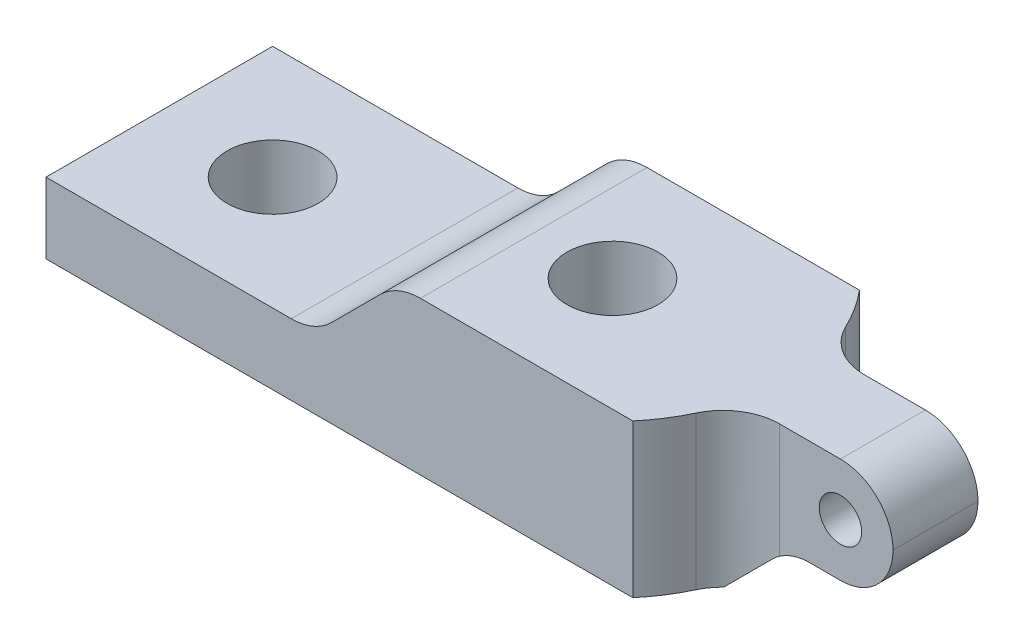
ISO-10303-21;
HEADER;
FILE_DESCRIPTION(('STEP AP214'),'2;1');
FILE_NAME('part.step','',(''),(''),'','','');
FILE_SCHEMA(('AUTOMOTIVE_DESIGN { 1 0 10303 214 1 1 1 1 }'));
ENDSEC;
DATA;
#1=APPLICATION_CONTEXT('core data for automotive mechanical design processes');
#2=APPLICATION_PROTOCOL_DEFINITION('international standard','automotive_design',2000,#1);
#3=PRODUCT_CONTEXT('',#1,'mechanical');
#4=PRODUCT('Part','Part','',(#3));
#5=PRODUCT_RELATED_PRODUCT_CATEGORY('part','',(#4));
#6=PRODUCT_DEFINITION_FORMATION('','',#4);
#7=PRODUCT_DEFINITION_CONTEXT('part definition',#1,'design');
#8=PRODUCT_DEFINITION('design','',#6,#7);
#9=PRODUCT_DEFINITION_SHAPE('','',#8);
#10=(LENGTH_UNIT() NAMED_UNIT(*) SI_UNIT(.MILLI.,.METRE.));
#11=(NAMED_UNIT(*) PLANE_ANGLE_UNIT() SI_UNIT($,.RADIAN.));
#12=(NAMED_UNIT(*) SI_UNIT($,.STERADIAN.) SOLID_ANGLE_UNIT());
#13=UNCERTAINTY_MEASURE_WITH_UNIT(LENGTH_MEASURE(1.E-05),#10,'distance_accuracy_value','');
#14=(GEOMETRIC_REPRESENTATION_CONTEXT(3) GLOBAL_UNCERTAINTY_ASSIGNED_CONTEXT((#13)) GLOBAL_UNIT_ASSIGNED_CONTEXT((#10,
#11,#12)) REPRESENTATION_CONTEXT('',''));
#15=CARTESIAN_POINT('',(0.,0.,0.));
#16=DIRECTION('',(0.,0.,1.));
#17=DIRECTION('',(1.,0.,0.));
#18=AXIS2_PLACEMENT_3D('',#15,#16,#17);
#19=CARTESIAN_POINT('',(0.,0.,12.7));
#20=DIRECTION('',(0.,0.,-1.));
#21=DIRECTION('',(-1.,0.,0.));
#22=AXIS2_PLACEMENT_3D('',#19,#20,#21);
#23=PLANE('',#22);
#24=DIRECTION('',(1.,0.,0.));
#25=VECTOR('',#24,1.);
#26=CARTESIAN_POINT('',(-5.63371999999998,-5.63372,12.7));
#27=LINE('',#26,#25);
#28=CARTESIAN_POINT('',(-40.55872,-5.63372000000001,12.7));
#29=VERTEX_POINT('',#28);
#30=CARTESIAN_POINT('',(-7.67049747643005,-5.63372000000001,12.7));
#31=VERTEX_POINT('',#30);
#32=EDGE_CURVE('E164',#29,#31,#27,.T.);
#33=ORIENTED_EDGE('',*,*,#32,.T.);
#34=DIRECTION('',(0.,1.,0.));
#35=VECTOR('',#34,1.);
#36=CARTESIAN_POINT('',(-7.67049747643005,-5.63372000000001,12.7));
#37=LINE('',#36,#35);
#38=CARTESIAN_POINT('',(-7.67049747643005,2.9464,12.7));
#39=VERTEX_POINT('',#38);
#40=EDGE_CURVE('E168',#31,#39,#37,.T.);
#41=ORIENTED_EDGE('',*,*,#40,.T.);
#42=DIRECTION('',(-1.,0.,0.));
#43=VECTOR('',#42,1.);
#44=CARTESIAN_POINT('',(-40.55872,2.9464,12.7));
#45=LINE('',#44,#43);
#46=CARTESIAN_POINT('',(-19.5712919394654,2.9464,12.7));
#47=VERTEX_POINT('',#46);
#48=EDGE_CURVE('E185',#39,#47,#45,.T.);
#49=ORIENTED_EDGE('',*,*,#48,.T.);
#50=CARTESIAN_POINT('',(-19.5712919394654,-0.2286,12.7));
#51=DIRECTION('',(0.,0.,-1.));
#52=DIRECTION('',(-1.,0.,0.));
#53=AXIS2_PLACEMENT_3D('',#50,#51,#52);
#54=CIRCLE('',#53,3.175);
#55=CARTESIAN_POINT('',(-21.8163559697327,2.0164640302673,12.7));
#56=VERTEX_POINT('',#55);
#57=EDGE_CURVE('E424',#47,#56,#54,.F.);
#58=ORIENTED_EDGE('',*,*,#57,.T.);
#59=DIRECTION('',(0.707106781186551,0.707106781186544,0.));
#60=VECTOR('',#59,1.);
#61=CARTESIAN_POINT('',(-20.88642,2.94640000000001,12.7));
#62=LINE('',#61,#60);
#63=CARTESIAN_POINT('',(-24.5678540302673,-0.735034030267308,12.7));
#64=VERTEX_POINT('',#63);
#65=EDGE_CURVE('E401',#64,#56,#62,.T.);
#66=ORIENTED_EDGE('',*,*,#65,.F.);
#67=CARTESIAN_POINT('',(-26.8129180605346,1.51002999999999,12.7));
#68=DIRECTION('',(0.,0.,-1.));
#69=DIRECTION('',(-1.,0.,0.));
#70=AXIS2_PLACEMENT_3D('',#67,#68,#69);
#71=CIRCLE('',#70,3.175);
#72=CARTESIAN_POINT('',(-26.8129180605346,-1.66497000000001,12.7));
#73=VERTEX_POINT('',#72);
#74=EDGE_CURVE('E372',#64,#73,#71,.T.);
#75=ORIENTED_EDGE('',*,*,#74,.T.);
#76=DIRECTION('',(1.,0.,0.));
#77=VECTOR('',#76,1.);
#78=CARTESIAN_POINT('',(-25.49779,-1.66497000000001,12.7));
#79=LINE('',#78,#77);
#80=CARTESIAN_POINT('',(-40.55872,-1.66497000000001,12.7));
#81=VERTEX_POINT('',#80);
#82=EDGE_CURVE('E176',#81,#73,#79,.T.);
#83=ORIENTED_EDGE('',*,*,#82,.F.);
#84=DIRECTION('',(0.,-1.,0.));
#85=VECTOR('',#84,1.);
#86=CARTESIAN_POINT('',(-40.55872,-5.63372000000001,12.7));
#87=LINE('',#86,#85);
#88=EDGE_CURVE('E180',#81,#29,#87,.T.);
#89=ORIENTED_EDGE('',*,*,#88,.T.);
#90=EDGE_LOOP('',(#33,#41,#49,#58,#66,#75,#83,#89));
#91=FACE_BOUND('',#90,.T.);
#92=ADVANCED_FACE('F35',(#91),#23,.F.);
#93=CARTESIAN_POINT('',(0.,0.,0.));
#94=DIRECTION('',(0.,0.,-1.));
#95=DIRECTION('',(-1.,0.,0.));
#96=AXIS2_PLACEMENT_3D('',#93,#94,#95);
#97=PLANE('',#96);
#98=DIRECTION('',(0.,1.,0.));
#99=VECTOR('',#98,1.);
#100=CARTESIAN_POINT('',(-7.67049747643006,-5.63372000000001,0.));
#101=LINE('',#100,#99);
#102=CARTESIAN_POINT('',(-7.67049747643006,-5.63372000000001,0.));
#103=VERTEX_POINT('',#102);
#104=CARTESIAN_POINT('',(-7.67049747643006,2.9464,0.));
#105=VERTEX_POINT('',#104);
#106=EDGE_CURVE('E363',#103,#105,#101,.T.);
#107=ORIENTED_EDGE('',*,*,#106,.F.);
#108=DIRECTION('',(1.,0.,0.));
#109=VECTOR('',#108,1.);
#110=CARTESIAN_POINT('',(-5.63371999999998,-5.63372,0.));
#111=LINE('',#110,#109);
#112=CARTESIAN_POINT('',(-40.55872,-5.63372000000001,0.));
#113=VERTEX_POINT('',#112);
#114=EDGE_CURVE('E194',#113,#103,#111,.T.);
#115=ORIENTED_EDGE('',*,*,#114,.F.);
#116=DIRECTION('',(0.,-1.,0.));
#117=VECTOR('',#116,1.);
#118=CARTESIAN_POINT('',(-40.55872,-5.63372000000001,0.));
#119=LINE('',#118,#117);
#120=CARTESIAN_POINT('',(-40.55872,-1.66497000000001,0.));
#121=VERTEX_POINT('',#120);
#122=EDGE_CURVE('E191',#121,#113,#119,.T.);
#123=ORIENTED_EDGE('',*,*,#122,.F.);
#124=DIRECTION('',(1.,0.,0.));
#125=VECTOR('',#124,1.);
#126=CARTESIAN_POINT('',(-25.49779,-1.66497000000001,0.));
#127=LINE('',#126,#125);
#128=CARTESIAN_POINT('',(-26.8129180605346,-1.66497000000001,0.));
#129=VERTEX_POINT('',#128);
#130=EDGE_CURVE('E404',#121,#129,#127,.T.);
#131=ORIENTED_EDGE('',*,*,#130,.T.);
#132=CARTESIAN_POINT('',(-26.8129180605346,1.51002999999999,0.));
#133=DIRECTION('',(0.,0.,-1.));
#134=DIRECTION('',(-1.,0.,0.));
#135=AXIS2_PLACEMENT_3D('',#132,#133,#134);
#136=CIRCLE('',#135,3.175);
#137=CARTESIAN_POINT('',(-24.5678540302673,-0.735034030267308,0.));
#138=VERTEX_POINT('',#137);
#139=EDGE_CURVE('E368',#129,#138,#136,.F.);
#140=ORIENTED_EDGE('',*,*,#139,.T.);
#141=DIRECTION('',(0.707106781186551,0.707106781186544,0.));
#142=VECTOR('',#141,1.);
#143=CARTESIAN_POINT('',(-20.88642,2.94640000000001,0.));
#144=LINE('',#143,#142);
#145=CARTESIAN_POINT('',(-21.8163559697327,2.0164640302673,0.));
#146=VERTEX_POINT('',#145);
#147=EDGE_CURVE('E400',#138,#146,#144,.T.);
#148=ORIENTED_EDGE('',*,*,#147,.T.);
#149=CARTESIAN_POINT('',(-19.5712919394654,-0.2286,0.));
#150=DIRECTION('',(0.,0.,-1.));
#151=DIRECTION('',(-1.,0.,0.));
#152=AXIS2_PLACEMENT_3D('',#149,#150,#151);
#153=CIRCLE('',#152,3.175);
#154=CARTESIAN_POINT('',(-19.5712919394654,2.9464,0.));
#155=VERTEX_POINT('',#154);
#156=EDGE_CURVE('E426',#146,#155,#153,.T.);
#157=ORIENTED_EDGE('',*,*,#156,.T.);
#158=DIRECTION('',(-1.,0.,0.));
#159=VECTOR('',#158,1.);
#160=CARTESIAN_POINT('',(-40.55872,2.9464,0.));
#161=LINE('',#160,#159);
#162=EDGE_CURVE('E189',#105,#155,#161,.T.);
#163=ORIENTED_EDGE('',*,*,#162,.F.);
#164=EDGE_LOOP('',(#107,#115,#123,#131,#140,#148,#157,#163));
#165=FACE_BOUND('',#164,.T.);
#166=ADVANCED_FACE('F288',(#165),#97,.T.);
#167=CARTESIAN_POINT('',(-40.55872,2.9464,12.7));
#168=DIRECTION('',(0.,-1.,0.));
#169=DIRECTION('',(0.,0.,-1.));
#170=AXIS2_PLACEMENT_3D('',#167,#168,#169);
#171=PLANE('',#170);
#172=CARTESIAN_POINT('',(-15.15872,2.94640000000001,6.35));
#173=DIRECTION('',(0.,-1.,0.));
#174=DIRECTION('',(0.,0.,-1.));
#175=AXIS2_PLACEMENT_3D('',#172,#173,#174);
#176=CIRCLE('',#175,2.5527);
#177=CARTESIAN_POINT('',(-15.15872,2.94640000000001,3.79730000000001));
#178=VERTEX_POINT('',#177);
#179=EDGE_CURVE('E321',#178,#178,#176,.T.);
#180=ORIENTED_EDGE('',*,*,#179,.T.);
#181=EDGE_LOOP('',(#180));
#182=FACE_BOUND('',#181,.T.);
#183=ORIENTED_EDGE('',*,*,#48,.F.);
#184=CARTESIAN_POINT('',(-15.15872,2.9464,6.35));
#185=DIRECTION('',(0.,-1.,0.));
#186=DIRECTION('',(1.,0.,0.));
#187=AXIS2_PLACEMENT_3D('',#184,#185,#186);
#188=CIRCLE('',#187,9.81814527100205);
#189=CARTESIAN_POINT('',(-6.28356655853812,2.9464,10.5485268789193));
#190=VERTEX_POINT('',#189);
#191=EDGE_CURVE('E169',#190,#39,#188,.T.);
#192=ORIENTED_EDGE('',*,*,#191,.F.);
#193=CARTESIAN_POINT('',(-3.41351204224704,2.9464,11.90625));
#194=DIRECTION('',(0.,-1.,0.));
#195=DIRECTION('',(0.,0.,-1.));
#196=AXIS2_PLACEMENT_3D('',#193,#194,#195);
#197=CIRCLE('',#196,3.175);
#198=CARTESIAN_POINT('',(-3.41351204224704,2.94640000000001,8.73125));
#199=VERTEX_POINT('',#198);
#200=EDGE_CURVE('E12',#190,#199,#197,.T.);
#201=ORIENTED_EDGE('',*,*,#200,.T.);
#202=DIRECTION('',(1.,0.,0.));
#203=VECTOR('',#202,1.);
#204=CARTESIAN_POINT('',(2.9464,2.94640000000001,8.73125));
#205=LINE('',#204,#203);
#206=CARTESIAN_POINT('',(0.,2.94640000000001,8.73125));
#207=VERTEX_POINT('',#206);
#208=EDGE_CURVE('E203',#199,#207,#205,.T.);
#209=ORIENTED_EDGE('',*,*,#208,.T.);
#210=DIRECTION('',(0.,0.,-1.));
#211=VECTOR('',#210,1.);
#212=CARTESIAN_POINT('',(0.,2.9464,12.7));
#213=LINE('',#212,#211);
#214=CARTESIAN_POINT('',(0.,2.94640000000001,3.96875));
#215=VERTEX_POINT('',#214);
#216=EDGE_CURVE('E222',#207,#215,#213,.T.);
#217=ORIENTED_EDGE('',*,*,#216,.T.);
#218=DIRECTION('',(-1.,0.,0.));
#219=VECTOR('',#218,1.);
#220=CARTESIAN_POINT('',(2.9464,2.94640000000001,3.96875));
#221=LINE('',#220,#219);
#222=CARTESIAN_POINT('',(-3.41351204224704,2.94640000000001,3.96875));
#223=VERTEX_POINT('',#222);
#224=EDGE_CURVE('E355',#215,#223,#221,.T.);
#225=ORIENTED_EDGE('',*,*,#224,.T.);
#226=CARTESIAN_POINT('',(-3.41351204224704,2.9464,0.793750000000001));
#227=DIRECTION('',(0.,-1.,0.));
#228=DIRECTION('',(0.,0.,-1.));
#229=AXIS2_PLACEMENT_3D('',#226,#227,#228);
#230=CIRCLE('',#229,3.175);
#231=CARTESIAN_POINT('',(-6.28356655853812,2.9464,2.15147312108071));
#232=VERTEX_POINT('',#231);
#233=EDGE_CURVE('E253',#223,#232,#230,.T.);
#234=ORIENTED_EDGE('',*,*,#233,.T.);
#235=CARTESIAN_POINT('',(-15.15872,2.9464,6.35));
#236=DIRECTION('',(0.,-1.,0.));
#237=DIRECTION('',(-1.,0.,0.));
#238=AXIS2_PLACEMENT_3D('',#235,#236,#237);
#239=CIRCLE('',#238,9.81814527100205);
#240=EDGE_CURVE('E352',#105,#232,#239,.T.);
#241=ORIENTED_EDGE('',*,*,#240,.F.);
#242=ORIENTED_EDGE('',*,*,#162,.T.);
#243=DIRECTION('',(0.,0.,1.));
#244=VECTOR('',#243,1.);
#245=CARTESIAN_POINT('',(-19.5712919394654,2.9464,12.7));
#246=LINE('',#245,#244);
#247=EDGE_CURVE('E325',#155,#47,#246,.T.);
#248=ORIENTED_EDGE('',*,*,#247,.T.);
#249=EDGE_LOOP('',(#183,#192,#201,#209,#217,#225,#234,#241,#242,#248));
#250=FACE_BOUND('',#249,.T.);
#251=ADVANCED_FACE('F293',(#182,#250),#171,.F.);
#252=CARTESIAN_POINT('',(-40.55872,-5.63372000000001,12.7));
#253=DIRECTION('',(1.,0.,0.));
#254=DIRECTION('',(0.,0.,-1.));
#255=AXIS2_PLACEMENT_3D('',#252,#253,#254);
#256=PLANE('',#255);
#257=ORIENTED_EDGE('',*,*,#88,.F.);
#258=DIRECTION('',(0.,0.,1.));
#259=VECTOR('',#258,1.);
#260=CARTESIAN_POINT('',(-40.55872,-1.66497000000001,0.));
#261=LINE('',#260,#259);
#262=EDGE_CURVE('E397',#121,#81,#261,.T.);
#263=ORIENTED_EDGE('',*,*,#262,.F.);
#264=ORIENTED_EDGE('',*,*,#122,.T.);
#265=DIRECTION('',(0.,0.,-1.));
#266=VECTOR('',#265,1.);
#267=CARTESIAN_POINT('',(-40.55872,-5.63372000000001,12.7));
#268=LINE('',#267,#266);
#269=EDGE_CURVE('E183',#29,#113,#268,.T.);
#270=ORIENTED_EDGE('',*,*,#269,.F.);
#271=EDGE_LOOP('',(#257,#263,#264,#270));
#272=FACE_BOUND('',#271,.T.);
#273=ADVANCED_FACE('F310',(#272),#256,.F.);
#274=CARTESIAN_POINT('',(-5.63371999999998,-5.63372,12.7));
#275=DIRECTION('',(0.,1.,0.));
#276=DIRECTION('',(-1.,0.,0.));
#277=AXIS2_PLACEMENT_3D('',#274,#275,#276);
#278=PLANE('',#277);
#279=CARTESIAN_POINT('',(-15.15872,-5.63372,6.35));
#280=DIRECTION('',(0.,-1.,0.));
#281=DIRECTION('',(0.,0.,-1.));
#282=AXIS2_PLACEMENT_3D('',#279,#280,#281);
#283=CIRCLE('',#282,2.55269999999999);
#284=CARTESIAN_POINT('',(-15.15872,-5.63372,3.79730000000002));
#285=VERTEX_POINT('',#284);
#286=EDGE_CURVE('E393',#285,#285,#283,.T.);
#287=ORIENTED_EDGE('',*,*,#286,.F.);
#288=EDGE_LOOP('',(#287));
#289=FACE_BOUND('',#288,.T.);
#290=CARTESIAN_POINT('',(-34.20872,-5.63372000000001,6.35));
#291=DIRECTION('',(0.,-1.,0.));
#292=DIRECTION('',(0.,0.,-1.));
#293=AXIS2_PLACEMENT_3D('',#290,#291,#292);
#294=CIRCLE('',#293,2.55269999999998);
#295=CARTESIAN_POINT('',(-34.20872,-5.63372000000001,3.79730000000002));
#296=VERTEX_POINT('',#295);
#297=EDGE_CURVE('E389',#296,#296,#294,.T.);
#298=ORIENTED_EDGE('',*,*,#297,.F.);
#299=EDGE_LOOP('',(#298));
#300=FACE_BOUND('',#299,.T.);
#301=DIRECTION('',(0.,0.,-1.));
#302=VECTOR('',#301,1.);
#303=CARTESIAN_POINT('',(-5.63371999999998,-5.63372,12.7));
#304=LINE('',#303,#302);
#305=CARTESIAN_POINT('',(-5.63371999999998,-5.63372,9.6366020924314));
#306=VERTEX_POINT('',#305);
#307=CARTESIAN_POINT('',(-5.63371999999998,-5.63372,3.0633979075686));
#308=VERTEX_POINT('',#307);
#309=EDGE_CURVE('E51',#306,#308,#304,.T.);
#310=ORIENTED_EDGE('',*,*,#309,.F.);
#311=CARTESIAN_POINT('',(-3.41351204224704,-5.63372,11.90625));
#312=DIRECTION('',(0.,1.,0.));
#313=DIRECTION('',(-1.,0.,0.));
#314=AXIS2_PLACEMENT_3D('',#311,#312,#313);
#315=CIRCLE('',#314,3.175);
#316=CARTESIAN_POINT('',(-6.28356655853812,-5.63372000000001,10.5485268789193));
#317=VERTEX_POINT('',#316);
#318=EDGE_CURVE('E44',#306,#317,#315,.T.);
#319=ORIENTED_EDGE('',*,*,#318,.T.);
#320=CARTESIAN_POINT('',(-15.15872,-5.63372000000001,6.35));
#321=DIRECTION('',(0.,-1.,0.));
#322=DIRECTION('',(1.,0.,0.));
#323=AXIS2_PLACEMENT_3D('',#320,#321,#322);
#324=CIRCLE('',#323,9.81814527100205);
#325=EDGE_CURVE('E159',#317,#31,#324,.T.);
#326=ORIENTED_EDGE('',*,*,#325,.T.);
#327=ORIENTED_EDGE('',*,*,#32,.F.);
#328=ORIENTED_EDGE('',*,*,#269,.T.);
#329=ORIENTED_EDGE('',*,*,#114,.T.);
#330=CARTESIAN_POINT('',(-15.15872,-5.63372000000001,6.35));
#331=DIRECTION('',(0.,-1.,0.));
#332=DIRECTION('',(-1.,0.,0.));
#333=AXIS2_PLACEMENT_3D('',#330,#331,#332);
#334=CIRCLE('',#333,9.81814527100205);
#335=CARTESIAN_POINT('',(-6.28356655853812,-5.63372000000001,2.15147312108071));
#336=VERTEX_POINT('',#335);
#337=EDGE_CURVE('E364',#103,#336,#334,.T.);
#338=ORIENTED_EDGE('',*,*,#337,.T.);
#339=CARTESIAN_POINT('',(-3.41351204224704,-5.63372,0.793750000000001));
#340=DIRECTION('',(0.,1.,0.));
#341=DIRECTION('',(-1.,0.,0.));
#342=AXIS2_PLACEMENT_3D('',#339,#340,#341);
#343=CIRCLE('',#342,3.175);
#344=EDGE_CURVE('E244',#336,#308,#343,.T.);
#345=ORIENTED_EDGE('',*,*,#344,.T.);
#346=EDGE_LOOP('',(#310,#319,#326,#327,#328,#329,#338,#345));
#347=FACE_BOUND('',#346,.T.);
#348=ADVANCED_FACE('F161',(#289,#300,#347),#278,.F.);
#349=CARTESIAN_POINT('',(-2.94639999999999,-2.9464,12.7));
#350=DIRECTION('',(-0.707106781186549,0.707106781186546,0.));
#351=DIRECTION('',(-0.707106781186546,-0.707106781186549,0.));
#352=AXIS2_PLACEMENT_3D('',#349,#350,#351);
#353=PLANE('',#352);
#354=ORIENTED_EDGE('',*,*,#309,.T.);
#355=CARTESIAN_POINT('',(-3.41351204224704,-3.41351204224705,0.793750000000001));
#356=DIRECTION('',(-0.707106781186549,0.707106781186546,0.));
#357=DIRECTION('',(0.707106781186546,0.707106781186549,0.));
#358=AXIS2_PLACEMENT_3D('',#355,#356,#357);
#359=ELLIPSE('',#358,4.49012806053459,3.175);
#360=CARTESIAN_POINT('',(-3.80938057991195,-3.80938057991196,3.94397429374276));
#361=VERTEX_POINT('',#360);
#362=EDGE_CURVE('E240',#308,#361,#359,.T.);
#363=ORIENTED_EDGE('',*,*,#362,.T.);
#364=DIRECTION('',(0.,0.,-1.));
#365=VECTOR('',#364,1.);
#366=CARTESIAN_POINT('',(-3.80938057991195,-3.80938057991196,8.73125));
#367=LINE('',#366,#365);
#368=CARTESIAN_POINT('',(-3.80938057991195,-3.80938057991196,8.75602570625724));
#369=VERTEX_POINT('',#368);
#370=EDGE_CURVE('E58',#361,#369,#367,.F.);
#371=ORIENTED_EDGE('',*,*,#370,.T.);
#372=CARTESIAN_POINT('',(-3.41351204224704,-3.41351204224705,11.90625));
#373=DIRECTION('',(-0.707106781186549,0.707106781186546,0.));
#374=DIRECTION('',(0.707106781186546,0.707106781186549,0.));
#375=AXIS2_PLACEMENT_3D('',#372,#373,#374);
#376=ELLIPSE('',#375,4.49012806053459,3.175);
#377=EDGE_CURVE('E337',#369,#306,#376,.T.);
#378=ORIENTED_EDGE('',*,*,#377,.T.);
#379=EDGE_LOOP('',(#354,#363,#371,#378));
#380=FACE_BOUND('',#379,.T.);
#381=ADVANCED_FACE('F304',(#380),#353,.F.);
#382=CARTESIAN_POINT('',(2.9464,-2.9464,12.7));
#383=DIRECTION('',(0.,1.,0.));
#384=DIRECTION('',(-1.,0.,0.));
#385=AXIS2_PLACEMENT_3D('',#382,#383,#384);
#386=PLANE('',#385);
#387=DIRECTION('',(-1.,0.,0.));
#388=VECTOR('',#387,1.);
#389=CARTESIAN_POINT('',(2.9464,-2.9464,8.73125));
#390=LINE('',#389,#388);
#391=CARTESIAN_POINT('',(0.,-2.9464,8.73125));
#392=VERTEX_POINT('',#391);
#393=CARTESIAN_POINT('',(-1.7259611598239,-2.9464,8.73125));
#394=VERTEX_POINT('',#393);
#395=EDGE_CURVE('E192',#392,#394,#390,.T.);
#396=ORIENTED_EDGE('',*,*,#395,.T.);
#397=DIRECTION('',(0.,0.,-1.));
#398=VECTOR('',#397,1.);
#399=CARTESIAN_POINT('',(-1.7259611598239,-2.9464,3.96875));
#400=LINE('',#399,#398);
#401=CARTESIAN_POINT('',(-1.7259611598239,-2.9464,3.96875));
#402=VERTEX_POINT('',#401);
#403=EDGE_CURVE('E209',#394,#402,#400,.T.);
#404=ORIENTED_EDGE('',*,*,#403,.T.);
#405=DIRECTION('',(1.,0.,0.));
#406=VECTOR('',#405,1.);
#407=CARTESIAN_POINT('',(2.9464,-2.9464,3.96875));
#408=LINE('',#407,#406);
#409=CARTESIAN_POINT('',(0.,-2.9464,3.96875));
#410=VERTEX_POINT('',#409);
#411=EDGE_CURVE('E202',#402,#410,#408,.T.);
#412=ORIENTED_EDGE('',*,*,#411,.T.);
#413=DIRECTION('',(0.,0.,-1.));
#414=VECTOR('',#413,1.);
#415=CARTESIAN_POINT('',(0.,-2.9464,12.7));
#416=LINE('',#415,#414);
#417=EDGE_CURVE('E198',#410,#392,#416,.F.);
#418=ORIENTED_EDGE('',*,*,#417,.T.);
#419=EDGE_LOOP('',(#396,#404,#412,#418));
#420=FACE_BOUND('',#419,.T.);
#421=ADVANCED_FACE('F300',(#420),#386,.F.);
#422=CARTESIAN_POINT('',(2.9464,2.94640000000001,3.96875));
#423=DIRECTION('',(0.,0.,1.));
#424=DIRECTION('',(1.,0.,0.));
#425=AXIS2_PLACEMENT_3D('',#422,#423,#424);
#426=PLANE('',#425);
#427=CARTESIAN_POINT('',(0.,0.,3.96875));
#428=DIRECTION('',(0.,0.,1.));
#429=DIRECTION('',(1.,0.,0.));
#430=AXIS2_PLACEMENT_3D('',#427,#428,#429);
#431=CIRCLE('',#430,1.190625);
#432=CARTESIAN_POINT('',(1.190625,0.,3.96875));
#433=VERTEX_POINT('',#432);
#434=EDGE_CURVE('E199',#433,#433,#431,.T.);
#435=ORIENTED_EDGE('',*,*,#434,.T.);
#436=EDGE_LOOP('',(#435));
#437=FACE_BOUND('',#436,.T.);
#438=CARTESIAN_POINT('',(-1.7259611598239,-5.8928,3.96875));
#439=DIRECTION('',(0.,0.,1.));
#440=DIRECTION('',(1.,0.,0.));
#441=AXIS2_PLACEMENT_3D('',#438,#439,#440);
#442=CIRCLE('',#441,2.9464);
#443=CARTESIAN_POINT('',(-3.41351204224704,-3.47754742951532,3.96875));
#444=VERTEX_POINT('',#443);
#445=EDGE_CURVE('E224',#402,#444,#442,.T.);
#446=ORIENTED_EDGE('',*,*,#445,.T.);
#447=DIRECTION('',(0.,-1.,0.));
#448=VECTOR('',#447,1.);
#449=CARTESIAN_POINT('',(-3.41351204224704,2.94640000000001,3.96875));
#450=LINE('',#449,#448);
#451=EDGE_CURVE('E367',#444,#223,#450,.F.);
#452=ORIENTED_EDGE('',*,*,#451,.T.);
#453=ORIENTED_EDGE('',*,*,#224,.F.);
#454=CARTESIAN_POINT('',(0.,0.,3.96875));
#455=DIRECTION('',(0.,0.,1.));
#456=DIRECTION('',(1.,0.,0.));
#457=AXIS2_PLACEMENT_3D('',#454,#455,#456);
#458=CIRCLE('',#457,2.9464);
#459=CARTESIAN_POINT('',(2.9464,0.,3.96875));
#460=VERTEX_POINT('',#459);
#461=EDGE_CURVE('E213',#215,#460,#458,.F.);
#462=ORIENTED_EDGE('',*,*,#461,.T.);
#463=CARTESIAN_POINT('',(0.,0.,3.96875));
#464=DIRECTION('',(0.,0.,1.));
#465=DIRECTION('',(1.,0.,0.));
#466=AXIS2_PLACEMENT_3D('',#463,#464,#465);
#467=CIRCLE('',#466,2.9464);
#468=EDGE_CURVE('E215',#460,#410,#467,.F.);
#469=ORIENTED_EDGE('',*,*,#468,.T.);
#470=ORIENTED_EDGE('',*,*,#411,.F.);
#471=EDGE_LOOP('',(#446,#452,#453,#462,#469,#470));
#472=FACE_BOUND('',#471,.T.);
#473=ADVANCED_FACE('F303',(#437,#472),#426,.F.);
#474=CARTESIAN_POINT('',(2.9464,2.94640000000001,8.73125));
#475=DIRECTION('',(0.,0.,-1.));
#476=DIRECTION('',(-1.,0.,0.));
#477=AXIS2_PLACEMENT_3D('',#474,#475,#476);
#478=PLANE('',#477);
#479=CARTESIAN_POINT('',(0.,0.,8.73125));
#480=DIRECTION('',(0.,0.,-1.));
#481=DIRECTION('',(-1.,0.,0.));
#482=AXIS2_PLACEMENT_3D('',#479,#480,#481);
#483=CIRCLE('',#482,1.190625);
#484=CARTESIAN_POINT('',(-1.190625,0.,8.73125));
#485=VERTEX_POINT('',#484);
#486=EDGE_CURVE('E204',#485,#485,#483,.T.);
#487=ORIENTED_EDGE('',*,*,#486,.T.);
#488=EDGE_LOOP('',(#487));
#489=FACE_BOUND('',#488,.T.);
#490=ORIENTED_EDGE('',*,*,#208,.F.);
#491=DIRECTION('',(0.,-1.,0.));
#492=VECTOR('',#491,1.);
#493=CARTESIAN_POINT('',(-3.41351204224704,-5.63372,8.73125));
#494=LINE('',#493,#492);
#495=CARTESIAN_POINT('',(-3.41351204224704,-3.47754742951531,8.73125));
#496=VERTEX_POINT('',#495);
#497=EDGE_CURVE('E370',#199,#496,#494,.T.);
#498=ORIENTED_EDGE('',*,*,#497,.T.);
#499=CARTESIAN_POINT('',(-1.7259611598239,-5.8928,8.73125));
#500=DIRECTION('',(0.,0.,-1.));
#501=DIRECTION('',(-1.,0.,0.));
#502=AXIS2_PLACEMENT_3D('',#499,#500,#501);
#503=CIRCLE('',#502,2.9464);
#504=EDGE_CURVE('E228',#496,#394,#503,.T.);
#505=ORIENTED_EDGE('',*,*,#504,.T.);
#506=ORIENTED_EDGE('',*,*,#395,.F.);
#507=CARTESIAN_POINT('',(0.,0.,8.73125));
#508=DIRECTION('',(0.,0.,-1.));
#509=DIRECTION('',(-1.,0.,0.));
#510=AXIS2_PLACEMENT_3D('',#507,#508,#509);
#511=CIRCLE('',#510,2.9464);
#512=CARTESIAN_POINT('',(2.9464,0.,8.73125));
#513=VERTEX_POINT('',#512);
#514=EDGE_CURVE('E220',#392,#513,#511,.F.);
#515=ORIENTED_EDGE('',*,*,#514,.T.);
#516=CARTESIAN_POINT('',(0.,0.,8.73125));
#517=DIRECTION('',(0.,0.,-1.));
#518=DIRECTION('',(-1.,0.,0.));
#519=AXIS2_PLACEMENT_3D('',#516,#517,#518);
#520=CIRCLE('',#519,2.9464);
#521=EDGE_CURVE('E217',#513,#207,#520,.F.);
#522=ORIENTED_EDGE('',*,*,#521,.T.);
#523=EDGE_LOOP('',(#490,#498,#505,#506,#515,#522));
#524=FACE_BOUND('',#523,.T.);
#525=ADVANCED_FACE('F383',(#489,#524),#478,.F.);
#526=CARTESIAN_POINT('',(0.,0.,12.7));
#527=DIRECTION('',(0.,0.,-1.));
#528=DIRECTION('',(-1.,0.,0.));
#529=AXIS2_PLACEMENT_3D('',#526,#527,#528);
#530=CYLINDRICAL_SURFACE('',#529,1.190625);
#531=ORIENTED_EDGE('',*,*,#486,.F.);
#532=EDGE_LOOP('',(#531));
#533=FACE_BOUND('',#532,.T.);
#534=ORIENTED_EDGE('',*,*,#434,.F.);
#535=EDGE_LOOP('',(#534));
#536=FACE_BOUND('',#535,.T.);
#537=ADVANCED_FACE('F297',(#533,#536),#530,.F.);
#538=CARTESIAN_POINT('',(-1.7259611598239,-5.8928,12.7));
#539=DIRECTION('',(0.,0.,1.));
#540=DIRECTION('',(1.,0.,0.));
#541=AXIS2_PLACEMENT_3D('',#538,#539,#540);
#542=CYLINDRICAL_SURFACE('',#541,2.9464);
#543=ORIENTED_EDGE('',*,*,#504,.F.);
#544=CARTESIAN_POINT('',(-3.41351204224704,-3.47754742951531,8.73125));
#545=CARTESIAN_POINT('',(-3.44894121281623,-3.50230041230882,8.73124934783232));
#546=CARTESIAN_POINT('',(-3.48382160804293,-3.52783317782863,8.73184298727939));
#547=CARTESIAN_POINT('',(-3.55232233783902,-3.58032658262233,8.73410134086659));
#548=CARTESIAN_POINT('',(-3.58594550433002,-3.60728363559887,8.73576347246754));
#549=CARTESIAN_POINT('',(-3.65193961305682,-3.66261292704867,8.74004234115792));
#550=CARTESIAN_POINT('',(-3.68431059468367,-3.69098512094024,8.74265904819141));
#551=CARTESIAN_POINT('',(-3.74781426232083,-3.74914831970876,8.74873716663029));
#552=CARTESIAN_POINT('',(-3.77894377081219,-3.77894258392375,8.75220060168555));
#553=CARTESIAN_POINT('',(-3.80938057991195,-3.80938057991196,8.75602570625724));
#554=B_SPLINE_CURVE_WITH_KNOTS('',3,(#544,#545,#546,#547,#548,#549,#550,#551,#552,#553),
.UNSPECIFIED.,.F.,.F.,(4,2,2,2,4),(0.,0.129639673325148,0.258967180458423,0.388290615911677,
0.517926204272734),.UNSPECIFIED.);
#555=EDGE_CURVE('E339',#496,#369,#554,.T.);
#556=ORIENTED_EDGE('',*,*,#555,.T.);
#557=ORIENTED_EDGE('',*,*,#370,.F.);
#558=CARTESIAN_POINT('',(-3.80938057991195,-3.80938057991196,3.94397429374276));
#559=CARTESIAN_POINT('',(-3.77894377081219,-3.77894258392375,3.94779939831444));
#560=CARTESIAN_POINT('',(-3.74781426232083,-3.74914831970876,3.95126283336971));
#561=CARTESIAN_POINT('',(-3.68431059468367,-3.69098512094024,3.95734095180859));
#562=CARTESIAN_POINT('',(-3.65193961305682,-3.66261292704867,3.95995765884208));
#563=CARTESIAN_POINT('',(-3.58594550433002,-3.60728363559888,3.96423652753246));
#564=CARTESIAN_POINT('',(-3.55232233783902,-3.58032658262234,3.96589865913341));
#565=CARTESIAN_POINT('',(-3.48382160804293,-3.52783317782863,3.96815701272061));
#566=CARTESIAN_POINT('',(-3.44894121281623,-3.50230041230882,3.96875065216767));
#567=CARTESIAN_POINT('',(-3.41351204224704,-3.47754742951532,3.96875));
#568=B_SPLINE_CURVE_WITH_KNOTS('',3,(#558,#559,#560,#561,#562,#563,#564,#565,#566,#567),
.UNSPECIFIED.,.F.,.F.,(4,2,2,2,4),(0.,0.129635588361056,0.25895902381431,0.388286530947583,
0.517926204272731),.UNSPECIFIED.);
#569=EDGE_CURVE('E243',#361,#444,#568,.T.);
#570=ORIENTED_EDGE('',*,*,#569,.T.);
#571=ORIENTED_EDGE('',*,*,#445,.F.);
#572=ORIENTED_EDGE('',*,*,#403,.F.);
#573=EDGE_LOOP('',(#543,#556,#557,#570,#571,#572));
#574=FACE_BOUND('',#573,.T.);
#575=ADVANCED_FACE('F255',(#574),#542,.F.);
#576=CARTESIAN_POINT('',(0.,0.,12.7));
#577=DIRECTION('',(0.,0.,-1.));
#578=DIRECTION('',(-1.,0.,0.));
#579=AXIS2_PLACEMENT_3D('',#576,#577,#578);
#580=CYLINDRICAL_SURFACE('',#579,2.9464);
#581=ORIENTED_EDGE('',*,*,#216,.F.);
#582=ORIENTED_EDGE('',*,*,#521,.F.);
#583=DIRECTION('',(0.,0.,-1.));
#584=VECTOR('',#583,1.);
#585=CARTESIAN_POINT('',(2.9464,0.,12.7));
#586=LINE('',#585,#584);
#587=EDGE_CURVE('E387',#460,#513,#586,.F.);
#588=ORIENTED_EDGE('',*,*,#587,.F.);
#589=ORIENTED_EDGE('',*,*,#461,.F.);
#590=EDGE_LOOP('',(#581,#582,#588,#589));
#591=FACE_BOUND('',#590,.T.);
#592=ADVANCED_FACE('F274',(#591),#580,.T.);
#593=CARTESIAN_POINT('',(0.,0.,12.7));
#594=DIRECTION('',(0.,0.,-1.));
#595=DIRECTION('',(-1.,0.,0.));
#596=AXIS2_PLACEMENT_3D('',#593,#594,#595);
#597=CYLINDRICAL_SURFACE('',#596,2.9464);
#598=ORIENTED_EDGE('',*,*,#514,.F.);
#599=ORIENTED_EDGE('',*,*,#417,.F.);
#600=ORIENTED_EDGE('',*,*,#468,.F.);
#601=ORIENTED_EDGE('',*,*,#587,.T.);
#602=EDGE_LOOP('',(#598,#599,#600,#601));
#603=FACE_BOUND('',#602,.T.);
#604=ADVANCED_FACE('F276',(#603),#597,.T.);
#605=CARTESIAN_POINT('',(-34.20872,-5.63372,6.35));
#606=DIRECTION('',(0.,-1.,0.));
#607=DIRECTION('',(0.,0.,-1.));
#608=AXIS2_PLACEMENT_3D('',#605,#606,#607);
#609=CYLINDRICAL_SURFACE('',#608,2.55269999999999);
#610=CARTESIAN_POINT('',(-34.20872,-1.66497000000001,6.35));
#611=DIRECTION('',(0.,-1.,0.));
#612=DIRECTION('',(1.,0.,0.));
#613=AXIS2_PLACEMENT_3D('',#610,#611,#612);
#614=CIRCLE('',#613,2.55269999999999);
#615=CARTESIAN_POINT('',(-31.65602,-1.66497000000001,6.35));
#616=VERTEX_POINT('',#615);
#617=EDGE_CURVE('E396',#616,#616,#614,.F.);
#618=ORIENTED_EDGE('',*,*,#617,.T.);
#619=EDGE_LOOP('',(#618));
#620=FACE_BOUND('',#619,.T.);
#621=ORIENTED_EDGE('',*,*,#297,.T.);
#622=EDGE_LOOP('',(#621));
#623=FACE_BOUND('',#622,.T.);
#624=ADVANCED_FACE('F279',(#620,#623),#609,.F.);
#625=CARTESIAN_POINT('',(-15.15872,-5.63372,6.35));
#626=DIRECTION('',(0.,-1.,0.));
#627=DIRECTION('',(0.,0.,-1.));
#628=AXIS2_PLACEMENT_3D('',#625,#626,#627);
#629=CYLINDRICAL_SURFACE('',#628,2.55269999999999);
#630=ORIENTED_EDGE('',*,*,#179,.F.);
#631=EDGE_LOOP('',(#630));
#632=FACE_BOUND('',#631,.T.);
#633=ORIENTED_EDGE('',*,*,#286,.T.);
#634=EDGE_LOOP('',(#633));
#635=FACE_BOUND('',#634,.T.);
#636=ADVANCED_FACE('F284',(#632,#635),#629,.F.);
#637=CARTESIAN_POINT('',(-25.49779,-1.66497000000001,0.));
#638=DIRECTION('',(0.,-1.,0.));
#639=DIRECTION('',(1.,0.,0.));
#640=AXIS2_PLACEMENT_3D('',#637,#638,#639);
#641=PLANE('',#640);
#642=ORIENTED_EDGE('',*,*,#82,.T.);
#643=DIRECTION('',(0.,0.,1.));
#644=VECTOR('',#643,1.);
#645=CARTESIAN_POINT('',(-26.8129180605346,-1.66497000000001,0.));
#646=LINE('',#645,#644);
#647=EDGE_CURVE('E428',#73,#129,#646,.F.);
#648=ORIENTED_EDGE('',*,*,#647,.T.);
#649=ORIENTED_EDGE('',*,*,#130,.F.);
#650=ORIENTED_EDGE('',*,*,#262,.T.);
#651=EDGE_LOOP('',(#642,#648,#649,#650));
#652=FACE_BOUND('',#651,.T.);
#653=ORIENTED_EDGE('',*,*,#617,.F.);
#654=EDGE_LOOP('',(#653));
#655=FACE_BOUND('',#654,.T.);
#656=ADVANCED_FACE('F436',(#652,#655),#641,.F.);
#657=CARTESIAN_POINT('',(-20.88642,2.94640000000001,0.));
#658=DIRECTION('',(0.707106781186544,-0.707106781186551,0.));
#659=DIRECTION('',(0.707106781186551,0.707106781186544,0.));
#660=AXIS2_PLACEMENT_3D('',#657,#658,#659);
#661=PLANE('',#660);
#662=ORIENTED_EDGE('',*,*,#147,.F.);
#663=DIRECTION('',(0.,0.,1.));
#664=VECTOR('',#663,1.);
#665=CARTESIAN_POINT('',(-24.5678540302673,-0.735034030267307,12.7));
#666=LINE('',#665,#664);
#667=EDGE_CURVE('E422',#138,#64,#666,.T.);
#668=ORIENTED_EDGE('',*,*,#667,.T.);
#669=ORIENTED_EDGE('',*,*,#65,.T.);
#670=DIRECTION('',(0.,0.,1.));
#671=VECTOR('',#670,1.);
#672=CARTESIAN_POINT('',(-21.8163559697327,2.0164640302673,0.));
#673=LINE('',#672,#671);
#674=EDGE_CURVE('E420',#56,#146,#673,.F.);
#675=ORIENTED_EDGE('',*,*,#674,.T.);
#676=EDGE_LOOP('',(#662,#668,#669,#675));
#677=FACE_BOUND('',#676,.T.);
#678=ADVANCED_FACE('F272',(#677),#661,.F.);
#679=CARTESIAN_POINT('',(-26.8129180605346,1.51002999999999,0.));
#680=DIRECTION('',(0.,0.,-1.));
#681=DIRECTION('',(-1.,0.,0.));
#682=AXIS2_PLACEMENT_3D('',#679,#680,#681);
#683=CYLINDRICAL_SURFACE('',#682,3.175);
#684=ORIENTED_EDGE('',*,*,#139,.F.);
#685=ORIENTED_EDGE('',*,*,#647,.F.);
#686=ORIENTED_EDGE('',*,*,#74,.F.);
#687=ORIENTED_EDGE('',*,*,#667,.F.);
#688=EDGE_LOOP('',(#684,#685,#686,#687));
#689=FACE_BOUND('',#688,.T.);
#690=ADVANCED_FACE('F268',(#689),#683,.F.);
#691=CARTESIAN_POINT('',(-19.5712919394654,-0.2286,12.7));
#692=DIRECTION('',(0.,0.,1.));
#693=DIRECTION('',(1.,0.,0.));
#694=AXIS2_PLACEMENT_3D('',#691,#692,#693);
#695=CYLINDRICAL_SURFACE('',#694,3.175);
#696=ORIENTED_EDGE('',*,*,#156,.F.);
#697=ORIENTED_EDGE('',*,*,#674,.F.);
#698=ORIENTED_EDGE('',*,*,#57,.F.);
#699=ORIENTED_EDGE('',*,*,#247,.F.);
#700=EDGE_LOOP('',(#696,#697,#698,#699));
#701=FACE_BOUND('',#700,.T.);
#702=ADVANCED_FACE('F265',(#701),#695,.T.);
#703=CARTESIAN_POINT('',(-15.15872,-5.63372000000001,6.35));
#704=DIRECTION('',(0.,1.,0.));
#705=DIRECTION('',(-1.,0.,0.));
#706=AXIS2_PLACEMENT_3D('',#703,#704,#705);
#707=CYLINDRICAL_SURFACE('',#706,9.81814527100205);
#708=ORIENTED_EDGE('',*,*,#325,.F.);
#709=DIRECTION('',(0.,1.,0.));
#710=VECTOR('',#709,1.);
#711=CARTESIAN_POINT('',(-6.28356655853812,-5.63372000000001,10.5485268789193));
#712=LINE('',#711,#710);
#713=EDGE_CURVE('E377',#317,#190,#712,.T.);
#714=ORIENTED_EDGE('',*,*,#713,.T.);
#715=ORIENTED_EDGE('',*,*,#191,.T.);
#716=ORIENTED_EDGE('',*,*,#40,.F.);
#717=EDGE_LOOP('',(#708,#714,#715,#716));
#718=FACE_BOUND('',#717,.T.);
#719=ADVANCED_FACE('F172',(#718),#707,.T.);
#720=CARTESIAN_POINT('',(-15.15872,-5.63372000000001,6.35));
#721=DIRECTION('',(0.,1.,0.));
#722=DIRECTION('',(-1.,0.,0.));
#723=AXIS2_PLACEMENT_3D('',#720,#721,#722);
#724=CYLINDRICAL_SURFACE('',#723,9.81814527100205);
#725=ORIENTED_EDGE('',*,*,#240,.T.);
#726=DIRECTION('',(0.,1.,0.));
#727=VECTOR('',#726,1.);
#728=CARTESIAN_POINT('',(-6.28356655853812,-5.63372000000001,2.15147312108071));
#729=LINE('',#728,#727);
#730=EDGE_CURVE('E360',#232,#336,#729,.F.);
#731=ORIENTED_EDGE('',*,*,#730,.T.);
#732=ORIENTED_EDGE('',*,*,#337,.F.);
#733=ORIENTED_EDGE('',*,*,#106,.T.);
#734=EDGE_LOOP('',(#725,#731,#732,#733));
#735=FACE_BOUND('',#734,.T.);
#736=ADVANCED_FACE('F263',(#735),#724,.T.);
#737=CARTESIAN_POINT('',(-3.41351204224704,-5.63372000000001,0.793750000000001));
#738=DIRECTION('',(0.,1.,0.));
#739=DIRECTION('',(-1.,0.,0.));
#740=AXIS2_PLACEMENT_3D('',#737,#738,#739);
#741=CYLINDRICAL_SURFACE('',#740,3.175);
#742=ORIENTED_EDGE('',*,*,#233,.F.);
#743=ORIENTED_EDGE('',*,*,#451,.F.);
#744=ORIENTED_EDGE('',*,*,#569,.F.);
#745=ORIENTED_EDGE('',*,*,#362,.F.);
#746=ORIENTED_EDGE('',*,*,#344,.F.);
#747=ORIENTED_EDGE('',*,*,#730,.F.);
#748=EDGE_LOOP('',(#742,#743,#744,#745,#746,#747));
#749=FACE_BOUND('',#748,.T.);
#750=ADVANCED_FACE('F259',(#749),#741,.F.);
#751=CARTESIAN_POINT('',(-3.41351204224704,-5.63372000000001,11.90625));
#752=DIRECTION('',(0.,1.,0.));
#753=DIRECTION('',(-1.,0.,0.));
#754=AXIS2_PLACEMENT_3D('',#751,#752,#753);
#755=CYLINDRICAL_SURFACE('',#754,3.175);
#756=ORIENTED_EDGE('',*,*,#200,.F.);
#757=ORIENTED_EDGE('',*,*,#713,.F.);
#758=ORIENTED_EDGE('',*,*,#318,.F.);
#759=ORIENTED_EDGE('',*,*,#377,.F.);
#760=ORIENTED_EDGE('',*,*,#555,.F.);
#761=ORIENTED_EDGE('',*,*,#497,.F.);
#762=EDGE_LOOP('',(#756,#757,#758,#759,#760,#761));
#763=FACE_BOUND('',#762,.T.);
#764=ADVANCED_FACE('F37',(#763),#755,.F.);
#765=CLOSED_SHELL('',(#92,#166,#251,#273,#348,#381,#421,#473,#525,#537,#575,#592,#604,#624,#636,
#656,#678,#690,#702,#719,#736,#750,#764));
#766=MANIFOLD_SOLID_BREP('B2',#765);
#767=ADVANCED_BREP_SHAPE_REPRESENTATION('',(#18,#766),#14);
#768=SHAPE_DEFINITION_REPRESENTATION(#9,#767);
ENDSEC;
END-ISO-10303-21;
